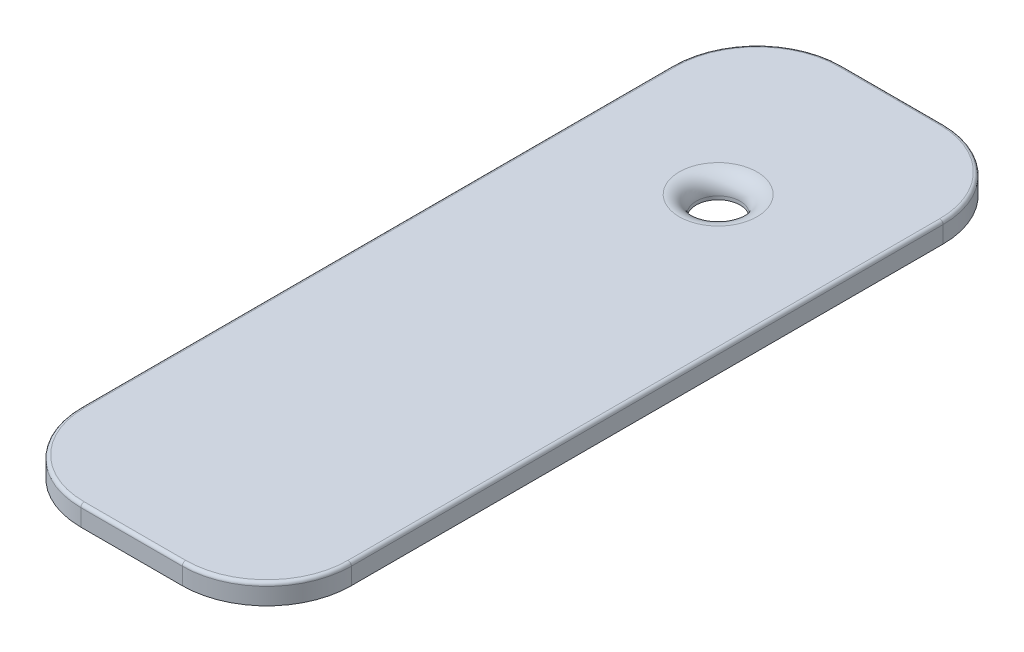
ISO-10303-21;
HEADER;
FILE_DESCRIPTION(('STEP AP214'),'2;1');
FILE_NAME('part.step','',(''),(''),'','','');
FILE_SCHEMA(('AUTOMOTIVE_DESIGN { 1 0 10303 214 1 1 1 1 }'));
ENDSEC;
DATA;
#1=APPLICATION_CONTEXT('core data for automotive mechanical design processes');
#2=APPLICATION_PROTOCOL_DEFINITION('international standard','automotive_design',2000,#1);
#3=PRODUCT_CONTEXT('',#1,'mechanical');
#4=PRODUCT('Part','Part','',(#3));
#5=PRODUCT_RELATED_PRODUCT_CATEGORY('part','',(#4));
#6=PRODUCT_DEFINITION_FORMATION('','',#4);
#7=PRODUCT_DEFINITION_CONTEXT('part definition',#1,'design');
#8=PRODUCT_DEFINITION('design','',#6,#7);
#9=PRODUCT_DEFINITION_SHAPE('','',#8);
#10=(LENGTH_UNIT() NAMED_UNIT(*) SI_UNIT(.MILLI.,.METRE.));
#11=(NAMED_UNIT(*) PLANE_ANGLE_UNIT() SI_UNIT($,.RADIAN.));
#12=(NAMED_UNIT(*) SI_UNIT($,.STERADIAN.) SOLID_ANGLE_UNIT());
#13=UNCERTAINTY_MEASURE_WITH_UNIT(LENGTH_MEASURE(1.E-05),#10,'distance_accuracy_value','');
#14=(GEOMETRIC_REPRESENTATION_CONTEXT(3) GLOBAL_UNCERTAINTY_ASSIGNED_CONTEXT((#13)) GLOBAL_UNIT_ASSIGNED_CONTEXT((#10,
#11,#12)) REPRESENTATION_CONTEXT('',''));
#15=CARTESIAN_POINT('',(0.,0.,0.));
#16=DIRECTION('',(0.,0.,1.));
#17=DIRECTION('',(1.,0.,0.));
#18=AXIS2_PLACEMENT_3D('',#15,#16,#17);
#19=CARTESIAN_POINT('',(18.5161231718812,6.,148.455918202134));
#20=DIRECTION('',(0.,-1.,0.));
#21=DIRECTION('',(0.,0.,-1.));
#22=AXIS2_PLACEMENT_3D('',#19,#20,#21);
#23=CYLINDRICAL_SURFACE('',#22,25.);
#24=DIRECTION('',(0.,-1.,0.));
#25=VECTOR('',#24,1.);
#26=CARTESIAN_POINT('',(43.5161231718812,6.,148.455918202134));
#27=LINE('',#26,#25);
#28=CARTESIAN_POINT('',(43.5161231718812,5.,148.455918202134));
#29=VERTEX_POINT('',#28);
#30=CARTESIAN_POINT('',(43.5161231718812,0.,148.455918202134));
#31=VERTEX_POINT('',#30);
#32=EDGE_CURVE('E126',#29,#31,#27,.T.);
#33=ORIENTED_EDGE('',*,*,#32,.F.);
#34=CARTESIAN_POINT('',(18.5161231718812,5.,148.455918202134));
#35=DIRECTION('',(0.,1.,0.));
#36=DIRECTION('',(0.,0.,1.));
#37=AXIS2_PLACEMENT_3D('',#34,#35,#36);
#38=CIRCLE('',#37,25.);
#39=CARTESIAN_POINT('',(18.516123171881,5.,173.455918202134));
#40=VERTEX_POINT('',#39);
#41=EDGE_CURVE('E204',#29,#40,#38,.F.);
#42=ORIENTED_EDGE('',*,*,#41,.T.);
#43=DIRECTION('',(0.,-1.,0.));
#44=VECTOR('',#43,1.);
#45=CARTESIAN_POINT('',(18.516123171881,6.,173.455918202134));
#46=LINE('',#45,#44);
#47=CARTESIAN_POINT('',(18.516123171881,0.,173.455918202134));
#48=VERTEX_POINT('',#47);
#49=EDGE_CURVE('E151',#40,#48,#46,.T.);
#50=ORIENTED_EDGE('',*,*,#49,.T.);
#51=CARTESIAN_POINT('',(18.5161231718812,0.,148.455918202134));
#52=DIRECTION('',(0.,1.,0.));
#53=DIRECTION('',(0.,0.,1.));
#54=AXIS2_PLACEMENT_3D('',#51,#52,#53);
#55=CIRCLE('',#54,25.);
#56=EDGE_CURVE('E145',#48,#31,#55,.T.);
#57=ORIENTED_EDGE('',*,*,#56,.T.);
#58=EDGE_LOOP('',(#33,#42,#50,#57));
#59=FACE_BOUND('',#58,.T.);
#60=ADVANCED_FACE('F36',(#59),#23,.T.);
#61=CARTESIAN_POINT('',(43.5161231718812,6.,-26.5440817978654));
#62=DIRECTION('',(-1.,0.,0.));
#63=DIRECTION('',(0.,0.,1.));
#64=AXIS2_PLACEMENT_3D('',#61,#62,#63);
#65=PLANE('',#64);
#66=DIRECTION('',(0.,-1.,0.));
#67=VECTOR('',#66,1.);
#68=CARTESIAN_POINT('',(43.5161231718812,6.,-26.5440817978654));
#69=LINE('',#68,#67);
#70=CARTESIAN_POINT('',(43.5161231718812,5.,-26.5440817978654));
#71=VERTEX_POINT('',#70);
#72=CARTESIAN_POINT('',(43.5161231718812,0.,-26.5440817978654));
#73=VERTEX_POINT('',#72);
#74=EDGE_CURVE('E139',#71,#73,#69,.T.);
#75=ORIENTED_EDGE('',*,*,#74,.F.);
#76=DIRECTION('',(0.,0.,-1.));
#77=VECTOR('',#76,1.);
#78=CARTESIAN_POINT('',(43.5161231718812,5.,148.455918202134));
#79=LINE('',#78,#77);
#80=EDGE_CURVE('E133',#71,#29,#79,.F.);
#81=ORIENTED_EDGE('',*,*,#80,.T.);
#82=ORIENTED_EDGE('',*,*,#32,.T.);
#83=DIRECTION('',(0.,0.,-1.));
#84=VECTOR('',#83,1.);
#85=CARTESIAN_POINT('',(43.5161231718812,0.,-26.5440817978654));
#86=LINE('',#85,#84);
#87=EDGE_CURVE('E130',#31,#73,#86,.T.);
#88=ORIENTED_EDGE('',*,*,#87,.T.);
#89=EDGE_LOOP('',(#75,#81,#82,#88));
#90=FACE_BOUND('',#89,.T.);
#91=ADVANCED_FACE('F129',(#90),#65,.F.);
#92=CARTESIAN_POINT('',(18.5161231718812,6.,-26.5440817978655));
#93=DIRECTION('',(0.,-1.,0.));
#94=DIRECTION('',(0.,0.,-1.));
#95=AXIS2_PLACEMENT_3D('',#92,#93,#94);
#96=CYLINDRICAL_SURFACE('',#95,25.);
#97=DIRECTION('',(0.,-1.,0.));
#98=VECTOR('',#97,1.);
#99=CARTESIAN_POINT('',(18.516123171881,6.,-51.5440817978655));
#100=LINE('',#99,#98);
#101=CARTESIAN_POINT('',(18.516123171881,5.,-51.5440817978655));
#102=VERTEX_POINT('',#101);
#103=CARTESIAN_POINT('',(18.516123171881,0.,-51.5440817978655));
#104=VERTEX_POINT('',#103);
#105=EDGE_CURVE('E185',#102,#104,#100,.T.);
#106=ORIENTED_EDGE('',*,*,#105,.F.);
#107=CARTESIAN_POINT('',(18.5161231718812,5.,-26.5440817978655));
#108=DIRECTION('',(0.,1.,0.));
#109=DIRECTION('',(0.,0.,1.));
#110=AXIS2_PLACEMENT_3D('',#107,#108,#109);
#111=CIRCLE('',#110,25.);
#112=EDGE_CURVE('E213',#102,#71,#111,.F.);
#113=ORIENTED_EDGE('',*,*,#112,.T.);
#114=ORIENTED_EDGE('',*,*,#74,.T.);
#115=CARTESIAN_POINT('',(18.5161231718812,0.,-26.5440817978655));
#116=DIRECTION('',(0.,1.,0.));
#117=DIRECTION('',(0.,0.,1.));
#118=AXIS2_PLACEMENT_3D('',#115,#116,#117);
#119=CIRCLE('',#118,25.);
#120=EDGE_CURVE('E148',#73,#104,#119,.T.);
#121=ORIENTED_EDGE('',*,*,#120,.T.);
#122=EDGE_LOOP('',(#106,#113,#114,#121));
#123=FACE_BOUND('',#122,.T.);
#124=ADVANCED_FACE('F253',(#123),#96,.T.);
#125=CARTESIAN_POINT('',(-11.4838768281187,6.,-51.5440817978655));
#126=DIRECTION('',(0.,0.,1.));
#127=DIRECTION('',(1.,0.,0.));
#128=AXIS2_PLACEMENT_3D('',#125,#126,#127);
#129=PLANE('',#128);
#130=DIRECTION('',(0.,-1.,0.));
#131=VECTOR('',#130,1.);
#132=CARTESIAN_POINT('',(-11.4838768281187,6.,-51.5440817978655));
#133=LINE('',#132,#131);
#134=CARTESIAN_POINT('',(-11.4838768281187,5.,-51.5440817978655));
#135=VERTEX_POINT('',#134);
#136=CARTESIAN_POINT('',(-11.4838768281187,0.,-51.5440817978655));
#137=VERTEX_POINT('',#136);
#138=EDGE_CURVE('E183',#135,#137,#133,.T.);
#139=ORIENTED_EDGE('',*,*,#138,.F.);
#140=DIRECTION('',(-1.,0.,0.));
#141=VECTOR('',#140,1.);
#142=CARTESIAN_POINT('',(18.516123171881,5.,-51.5440817978655));
#143=LINE('',#142,#141);
#144=EDGE_CURVE('E58',#135,#102,#143,.F.);
#145=ORIENTED_EDGE('',*,*,#144,.T.);
#146=ORIENTED_EDGE('',*,*,#105,.T.);
#147=DIRECTION('',(-1.,0.,0.));
#148=VECTOR('',#147,1.);
#149=CARTESIAN_POINT('',(-11.4838768281187,0.,-51.5440817978655));
#150=LINE('',#149,#148);
#151=EDGE_CURVE('E162',#104,#137,#150,.T.);
#152=ORIENTED_EDGE('',*,*,#151,.T.);
#153=EDGE_LOOP('',(#139,#145,#146,#152));
#154=FACE_BOUND('',#153,.T.);
#155=ADVANCED_FACE('F301',(#154),#129,.F.);
#156=CARTESIAN_POINT('',(-11.4838768281188,6.,-26.5440817978655));
#157=DIRECTION('',(0.,-1.,0.));
#158=DIRECTION('',(0.,0.,-1.));
#159=AXIS2_PLACEMENT_3D('',#156,#157,#158);
#160=CYLINDRICAL_SURFACE('',#159,25.);
#161=DIRECTION('',(0.,-1.,0.));
#162=VECTOR('',#161,1.);
#163=CARTESIAN_POINT('',(-36.4838768281189,6.,-26.5440817978654));
#164=LINE('',#163,#162);
#165=CARTESIAN_POINT('',(-36.4838768281189,5.,-26.5440817978654));
#166=VERTEX_POINT('',#165);
#167=CARTESIAN_POINT('',(-36.4838768281189,0.,-26.5440817978654));
#168=VERTEX_POINT('',#167);
#169=EDGE_CURVE('E181',#166,#168,#164,.T.);
#170=ORIENTED_EDGE('',*,*,#169,.F.);
#171=CARTESIAN_POINT('',(-11.4838768281188,5.,-26.5440817978655));
#172=DIRECTION('',(0.,1.,0.));
#173=DIRECTION('',(0.,0.,1.));
#174=AXIS2_PLACEMENT_3D('',#171,#172,#173);
#175=CIRCLE('',#174,25.);
#176=EDGE_CURVE('E51',#166,#135,#175,.F.);
#177=ORIENTED_EDGE('',*,*,#176,.T.);
#178=ORIENTED_EDGE('',*,*,#138,.T.);
#179=CARTESIAN_POINT('',(-11.4838768281188,0.,-26.5440817978655));
#180=DIRECTION('',(0.,1.,0.));
#181=DIRECTION('',(0.,0.,1.));
#182=AXIS2_PLACEMENT_3D('',#179,#180,#181);
#183=CIRCLE('',#182,25.);
#184=EDGE_CURVE('E165',#137,#168,#183,.T.);
#185=ORIENTED_EDGE('',*,*,#184,.T.);
#186=EDGE_LOOP('',(#170,#177,#178,#185));
#187=FACE_BOUND('',#186,.T.);
#188=ADVANCED_FACE('F305',(#187),#160,.T.);
#189=CARTESIAN_POINT('',(-36.4838768281189,6.,-26.5440817978654));
#190=DIRECTION('',(1.,0.,0.));
#191=DIRECTION('',(0.,0.,-1.));
#192=AXIS2_PLACEMENT_3D('',#189,#190,#191);
#193=PLANE('',#192);
#194=DIRECTION('',(0.,-1.,0.));
#195=VECTOR('',#194,1.);
#196=CARTESIAN_POINT('',(-36.4838768281189,6.,148.455918202134));
#197=LINE('',#196,#195);
#198=CARTESIAN_POINT('',(-36.4838768281189,5.,148.455918202134));
#199=VERTEX_POINT('',#198);
#200=CARTESIAN_POINT('',(-36.4838768281189,0.,148.455918202134));
#201=VERTEX_POINT('',#200);
#202=EDGE_CURVE('E179',#199,#201,#197,.T.);
#203=ORIENTED_EDGE('',*,*,#202,.F.);
#204=DIRECTION('',(0.,0.,1.));
#205=VECTOR('',#204,1.);
#206=CARTESIAN_POINT('',(-36.4838768281189,5.,-26.5440817978654));
#207=LINE('',#206,#205);
#208=EDGE_CURVE('E210',#199,#166,#207,.F.);
#209=ORIENTED_EDGE('',*,*,#208,.T.);
#210=ORIENTED_EDGE('',*,*,#169,.T.);
#211=DIRECTION('',(0.,0.,1.));
#212=VECTOR('',#211,1.);
#213=CARTESIAN_POINT('',(-36.4838768281189,0.,-26.5440817978654));
#214=LINE('',#213,#212);
#215=EDGE_CURVE('E168',#168,#201,#214,.T.);
#216=ORIENTED_EDGE('',*,*,#215,.T.);
#217=EDGE_LOOP('',(#203,#209,#210,#216));
#218=FACE_BOUND('',#217,.T.);
#219=ADVANCED_FACE('F308',(#218),#193,.F.);
#220=CARTESIAN_POINT('',(-11.4838768281188,6.,148.455918202134));
#221=DIRECTION('',(0.,-1.,0.));
#222=DIRECTION('',(0.,0.,-1.));
#223=AXIS2_PLACEMENT_3D('',#220,#221,#222);
#224=CYLINDRICAL_SURFACE('',#223,25.);
#225=DIRECTION('',(0.,-1.,0.));
#226=VECTOR('',#225,1.);
#227=CARTESIAN_POINT('',(-11.4838768281187,6.,173.455918202134));
#228=LINE('',#227,#226);
#229=CARTESIAN_POINT('',(-11.4838768281187,5.,173.455918202134));
#230=VERTEX_POINT('',#229);
#231=CARTESIAN_POINT('',(-11.4838768281187,0.,173.455918202134));
#232=VERTEX_POINT('',#231);
#233=EDGE_CURVE('E177',#230,#232,#228,.T.);
#234=ORIENTED_EDGE('',*,*,#233,.F.);
#235=CARTESIAN_POINT('',(-11.4838768281188,5.,148.455918202134));
#236=DIRECTION('',(0.,1.,0.));
#237=DIRECTION('',(0.,0.,1.));
#238=AXIS2_PLACEMENT_3D('',#235,#236,#237);
#239=CIRCLE('',#238,25.);
#240=EDGE_CURVE('E208',#230,#199,#239,.F.);
#241=ORIENTED_EDGE('',*,*,#240,.T.);
#242=ORIENTED_EDGE('',*,*,#202,.T.);
#243=CARTESIAN_POINT('',(-11.4838768281188,0.,148.455918202134));
#244=DIRECTION('',(0.,1.,0.));
#245=DIRECTION('',(0.,0.,-1.));
#246=AXIS2_PLACEMENT_3D('',#243,#244,#245);
#247=CIRCLE('',#246,25.);
#248=EDGE_CURVE('E171',#201,#232,#247,.T.);
#249=ORIENTED_EDGE('',*,*,#248,.T.);
#250=EDGE_LOOP('',(#234,#241,#242,#249));
#251=FACE_BOUND('',#250,.T.);
#252=ADVANCED_FACE('F326',(#251),#224,.T.);
#253=CARTESIAN_POINT('',(-11.4838768281187,6.,173.455918202134));
#254=DIRECTION('',(0.,0.,-1.));
#255=DIRECTION('',(-1.,0.,0.));
#256=AXIS2_PLACEMENT_3D('',#253,#254,#255);
#257=PLANE('',#256);
#258=ORIENTED_EDGE('',*,*,#49,.F.);
#259=DIRECTION('',(1.,0.,0.));
#260=VECTOR('',#259,1.);
#261=CARTESIAN_POINT('',(-11.4838768281187,5.,173.455918202134));
#262=LINE('',#261,#260);
#263=EDGE_CURVE('E206',#40,#230,#262,.F.);
#264=ORIENTED_EDGE('',*,*,#263,.T.);
#265=ORIENTED_EDGE('',*,*,#233,.T.);
#266=DIRECTION('',(1.,0.,0.));
#267=VECTOR('',#266,1.);
#268=CARTESIAN_POINT('',(-11.4838768281187,0.,173.455918202134));
#269=LINE('',#268,#267);
#270=EDGE_CURVE('E174',#232,#48,#269,.T.);
#271=ORIENTED_EDGE('',*,*,#270,.T.);
#272=EDGE_LOOP('',(#258,#264,#265,#271));
#273=FACE_BOUND('',#272,.T.);
#274=ADVANCED_FACE('F323',(#273),#257,.F.);
#275=CARTESIAN_POINT('',(18.5161231718812,6.,148.455918202134));
#276=DIRECTION('',(0.,1.,0.));
#277=DIRECTION('',(0.,0.,1.));
#278=AXIS2_PLACEMENT_3D('',#275,#276,#277);
#279=PLANE('',#278);
#280=CARTESIAN_POINT('',(3.51612317188115,6.,0.));
#281=DIRECTION('',(0.,1.,0.));
#282=DIRECTION('',(0.,0.,1.));
#283=AXIS2_PLACEMENT_3D('',#280,#281,#282);
#284=CIRCLE('',#283,11.5);
#285=CARTESIAN_POINT('',(3.51612317188115,6.,11.5));
#286=VERTEX_POINT('',#285);
#287=EDGE_CURVE('E11',#286,#286,#284,.F.);
#288=ORIENTED_EDGE('',*,*,#287,.T.);
#289=EDGE_LOOP('',(#288));
#290=FACE_BOUND('',#289,.T.);
#291=DIRECTION('',(1.,0.,0.));
#292=VECTOR('',#291,1.);
#293=CARTESIAN_POINT('',(18.516123171881,6.,172.455918202134));
#294=LINE('',#293,#292);
#295=CARTESIAN_POINT('',(-11.4838768281187,6.,172.455918202134));
#296=VERTEX_POINT('',#295);
#297=CARTESIAN_POINT('',(18.516123171881,6.,172.455918202134));
#298=VERTEX_POINT('',#297);
#299=EDGE_CURVE('E199',#296,#298,#294,.T.);
#300=ORIENTED_EDGE('',*,*,#299,.T.);
#301=CARTESIAN_POINT('',(18.5161231718812,6.,148.455918202134));
#302=DIRECTION('',(0.,1.,0.));
#303=DIRECTION('',(0.,0.,1.));
#304=AXIS2_PLACEMENT_3D('',#301,#302,#303);
#305=CIRCLE('',#304,24.);
#306=CARTESIAN_POINT('',(42.5161231718811,6.,148.455918202134));
#307=VERTEX_POINT('',#306);
#308=EDGE_CURVE('E201',#298,#307,#305,.T.);
#309=ORIENTED_EDGE('',*,*,#308,.T.);
#310=DIRECTION('',(0.,0.,-1.));
#311=VECTOR('',#310,1.);
#312=CARTESIAN_POINT('',(42.5161231718811,6.,-26.5440817978654));
#313=LINE('',#312,#311);
#314=CARTESIAN_POINT('',(42.5161231718811,6.,-26.5440817978654));
#315=VERTEX_POINT('',#314);
#316=EDGE_CURVE('E193',#307,#315,#313,.T.);
#317=ORIENTED_EDGE('',*,*,#316,.T.);
#318=CARTESIAN_POINT('',(18.5161231718812,6.,-26.5440817978655));
#319=DIRECTION('',(0.,1.,0.));
#320=DIRECTION('',(0.,0.,1.));
#321=AXIS2_PLACEMENT_3D('',#318,#319,#320);
#322=CIRCLE('',#321,24.);
#323=CARTESIAN_POINT('',(18.516123171881,6.,-50.5440817978655));
#324=VERTEX_POINT('',#323);
#325=EDGE_CURVE('E191',#315,#324,#322,.T.);
#326=ORIENTED_EDGE('',*,*,#325,.T.);
#327=DIRECTION('',(-1.,0.,0.));
#328=VECTOR('',#327,1.);
#329=CARTESIAN_POINT('',(-11.4838768281187,6.,-50.5440817978655));
#330=LINE('',#329,#328);
#331=CARTESIAN_POINT('',(-11.4838768281187,6.,-50.5440817978655));
#332=VERTEX_POINT('',#331);
#333=EDGE_CURVE('E138',#324,#332,#330,.T.);
#334=ORIENTED_EDGE('',*,*,#333,.T.);
#335=CARTESIAN_POINT('',(-11.4838768281188,6.,-26.5440817978655));
#336=DIRECTION('',(0.,1.,0.));
#337=DIRECTION('',(0.,0.,1.));
#338=AXIS2_PLACEMENT_3D('',#335,#336,#337);
#339=CIRCLE('',#338,24.);
#340=CARTESIAN_POINT('',(-35.4838768281189,6.,-26.5440817978654));
#341=VERTEX_POINT('',#340);
#342=EDGE_CURVE('E189',#332,#341,#339,.T.);
#343=ORIENTED_EDGE('',*,*,#342,.T.);
#344=DIRECTION('',(0.,0.,1.));
#345=VECTOR('',#344,1.);
#346=CARTESIAN_POINT('',(-35.4838768281189,6.,148.455918202134));
#347=LINE('',#346,#345);
#348=CARTESIAN_POINT('',(-35.4838768281189,6.,148.455918202134));
#349=VERTEX_POINT('',#348);
#350=EDGE_CURVE('E195',#341,#349,#347,.T.);
#351=ORIENTED_EDGE('',*,*,#350,.T.);
#352=CARTESIAN_POINT('',(-11.4838768281188,6.,148.455918202134));
#353=DIRECTION('',(0.,1.,0.));
#354=DIRECTION('',(0.,0.,1.));
#355=AXIS2_PLACEMENT_3D('',#352,#353,#354);
#356=CIRCLE('',#355,24.);
#357=EDGE_CURVE('E197',#349,#296,#356,.T.);
#358=ORIENTED_EDGE('',*,*,#357,.T.);
#359=EDGE_LOOP('',(#300,#309,#317,#326,#334,#343,#351,#358));
#360=FACE_BOUND('',#359,.T.);
#361=ADVANCED_FACE('F289',(#290,#360),#279,.T.);
#362=CARTESIAN_POINT('',(18.5161231718812,0.,148.455918202134));
#363=DIRECTION('',(0.,1.,0.));
#364=DIRECTION('',(0.,0.,1.));
#365=AXIS2_PLACEMENT_3D('',#362,#363,#364);
#366=PLANE('',#365);
#367=CARTESIAN_POINT('',(3.51612317188115,0.,0.));
#368=DIRECTION('',(0.,1.,0.));
#369=DIRECTION('',(0.,0.,1.));
#370=AXIS2_PLACEMENT_3D('',#367,#368,#369);
#371=CIRCLE('',#370,6.5);
#372=CARTESIAN_POINT('',(3.51612317188115,0.,6.5));
#373=VERTEX_POINT('',#372);
#374=EDGE_CURVE('E159',#373,#373,#371,.T.);
#375=ORIENTED_EDGE('',*,*,#374,.T.);
#376=EDGE_LOOP('',(#375));
#377=FACE_BOUND('',#376,.T.);
#378=ORIENTED_EDGE('',*,*,#56,.F.);
#379=ORIENTED_EDGE('',*,*,#270,.F.);
#380=ORIENTED_EDGE('',*,*,#248,.F.);
#381=ORIENTED_EDGE('',*,*,#215,.F.);
#382=ORIENTED_EDGE('',*,*,#184,.F.);
#383=ORIENTED_EDGE('',*,*,#151,.F.);
#384=ORIENTED_EDGE('',*,*,#120,.F.);
#385=ORIENTED_EDGE('',*,*,#87,.F.);
#386=EDGE_LOOP('',(#378,#379,#380,#381,#382,#383,#384,#385));
#387=FACE_BOUND('',#386,.T.);
#388=ADVANCED_FACE('F143',(#377,#387),#366,.F.);
#389=CARTESIAN_POINT('',(-11.4838768281188,5.,-26.5440817978655));
#390=DIRECTION('',(0.,1.,0.));
#391=DIRECTION('',(0.,0.,1.));
#392=AXIS2_PLACEMENT_3D('',#389,#390,#391);
#393=TOROIDAL_SURFACE('',#392,24.,1.);
#394=CARTESIAN_POINT('',(-11.4838768281187,5.,-50.5440817978655));
#395=DIRECTION('',(1.,0.,0.));
#396=DIRECTION('',(0.,0.,-1.));
#397=AXIS2_PLACEMENT_3D('',#394,#395,#396);
#398=CIRCLE('',#397,1.);
#399=EDGE_CURVE('E156',#135,#332,#398,.T.);
#400=ORIENTED_EDGE('',*,*,#399,.F.);
#401=ORIENTED_EDGE('',*,*,#176,.F.);
#402=CARTESIAN_POINT('',(-35.4838768281189,5.,-26.5440817978654));
#403=DIRECTION('',(0.,0.,1.));
#404=DIRECTION('',(1.,0.,0.));
#405=AXIS2_PLACEMENT_3D('',#402,#403,#404);
#406=CIRCLE('',#405,1.);
#407=EDGE_CURVE('E153',#341,#166,#406,.T.);
#408=ORIENTED_EDGE('',*,*,#407,.F.);
#409=ORIENTED_EDGE('',*,*,#342,.F.);
#410=EDGE_LOOP('',(#400,#401,#408,#409));
#411=FACE_BOUND('',#410,.T.);
#412=ADVANCED_FACE('F282',(#411),#393,.T.);
#413=CARTESIAN_POINT('',(-35.4838768281189,5.,148.455918202134));
#414=DIRECTION('',(0.,0.,-1.));
#415=DIRECTION('',(-1.,0.,0.));
#416=AXIS2_PLACEMENT_3D('',#413,#414,#415);
#417=CYLINDRICAL_SURFACE('',#416,1.);
#418=ORIENTED_EDGE('',*,*,#407,.T.);
#419=ORIENTED_EDGE('',*,*,#208,.F.);
#420=CARTESIAN_POINT('',(-35.4838768281189,5.,148.455918202134));
#421=DIRECTION('',(0.,0.,1.));
#422=DIRECTION('',(1.,0.,0.));
#423=AXIS2_PLACEMENT_3D('',#420,#421,#422);
#424=CIRCLE('',#423,1.);
#425=EDGE_CURVE('E230',#349,#199,#424,.T.);
#426=ORIENTED_EDGE('',*,*,#425,.F.);
#427=ORIENTED_EDGE('',*,*,#350,.F.);
#428=EDGE_LOOP('',(#418,#419,#426,#427));
#429=FACE_BOUND('',#428,.T.);
#430=ADVANCED_FACE('F279',(#429),#417,.T.);
#431=CARTESIAN_POINT('',(18.5161231718812,5.,-50.5440817978655));
#432=DIRECTION('',(1.,0.,0.));
#433=DIRECTION('',(0.,0.,-1.));
#434=AXIS2_PLACEMENT_3D('',#431,#432,#433);
#435=CYLINDRICAL_SURFACE('',#434,1.);
#436=ORIENTED_EDGE('',*,*,#399,.T.);
#437=ORIENTED_EDGE('',*,*,#333,.F.);
#438=CARTESIAN_POINT('',(18.516123171881,5.,-50.5440817978655));
#439=DIRECTION('',(1.,0.,0.));
#440=DIRECTION('',(0.,1.,0.));
#441=AXIS2_PLACEMENT_3D('',#438,#439,#440);
#442=CIRCLE('',#441,1.);
#443=EDGE_CURVE('E227',#102,#324,#442,.T.);
#444=ORIENTED_EDGE('',*,*,#443,.F.);
#445=ORIENTED_EDGE('',*,*,#144,.F.);
#446=EDGE_LOOP('',(#436,#437,#444,#445));
#447=FACE_BOUND('',#446,.T.);
#448=ADVANCED_FACE('F275',(#447),#435,.T.);
#449=CARTESIAN_POINT('',(-11.4838768281188,5.,148.455918202134));
#450=DIRECTION('',(0.,1.,0.));
#451=DIRECTION('',(0.,0.,1.));
#452=AXIS2_PLACEMENT_3D('',#449,#450,#451);
#453=TOROIDAL_SURFACE('',#452,24.,1.);
#454=ORIENTED_EDGE('',*,*,#425,.T.);
#455=ORIENTED_EDGE('',*,*,#240,.F.);
#456=CARTESIAN_POINT('',(-11.4838768281187,5.,172.455918202134));
#457=DIRECTION('',(1.,0.,0.));
#458=DIRECTION('',(0.,0.,-1.));
#459=AXIS2_PLACEMENT_3D('',#456,#457,#458);
#460=CIRCLE('',#459,1.);
#461=EDGE_CURVE('E224',#296,#230,#460,.T.);
#462=ORIENTED_EDGE('',*,*,#461,.F.);
#463=ORIENTED_EDGE('',*,*,#357,.F.);
#464=EDGE_LOOP('',(#454,#455,#462,#463));
#465=FACE_BOUND('',#464,.T.);
#466=ADVANCED_FACE('F271',(#465),#453,.T.);
#467=CARTESIAN_POINT('',(18.5161231718812,5.,-26.5440817978655));
#468=DIRECTION('',(0.,1.,0.));
#469=DIRECTION('',(0.,0.,1.));
#470=AXIS2_PLACEMENT_3D('',#467,#468,#469);
#471=TOROIDAL_SURFACE('',#470,24.,1.);
#472=ORIENTED_EDGE('',*,*,#443,.T.);
#473=ORIENTED_EDGE('',*,*,#325,.F.);
#474=CARTESIAN_POINT('',(42.5161231718811,5.,-26.5440817978654));
#475=DIRECTION('',(0.,0.,1.));
#476=DIRECTION('',(0.,-1.,0.));
#477=AXIS2_PLACEMENT_3D('',#474,#475,#476);
#478=CIRCLE('',#477,1.);
#479=EDGE_CURVE('E221',#71,#315,#478,.T.);
#480=ORIENTED_EDGE('',*,*,#479,.F.);
#481=ORIENTED_EDGE('',*,*,#112,.F.);
#482=EDGE_LOOP('',(#472,#473,#480,#481));
#483=FACE_BOUND('',#482,.T.);
#484=ADVANCED_FACE('F267',(#483),#471,.T.);
#485=CARTESIAN_POINT('',(18.5161231718812,5.,172.455918202134));
#486=DIRECTION('',(-1.,0.,0.));
#487=DIRECTION('',(0.,0.,1.));
#488=AXIS2_PLACEMENT_3D('',#485,#486,#487);
#489=CYLINDRICAL_SURFACE('',#488,1.);
#490=ORIENTED_EDGE('',*,*,#461,.T.);
#491=ORIENTED_EDGE('',*,*,#263,.F.);
#492=CARTESIAN_POINT('',(18.516123171881,5.,172.455918202134));
#493=DIRECTION('',(1.,0.,0.));
#494=DIRECTION('',(0.,0.,-1.));
#495=AXIS2_PLACEMENT_3D('',#492,#493,#494);
#496=CIRCLE('',#495,1.);
#497=EDGE_CURVE('E219',#298,#40,#496,.T.);
#498=ORIENTED_EDGE('',*,*,#497,.F.);
#499=ORIENTED_EDGE('',*,*,#299,.F.);
#500=EDGE_LOOP('',(#490,#491,#498,#499));
#501=FACE_BOUND('',#500,.T.);
#502=ADVANCED_FACE('F263',(#501),#489,.T.);
#503=CARTESIAN_POINT('',(42.5161231718811,5.,148.455918202134));
#504=DIRECTION('',(0.,0.,1.));
#505=DIRECTION('',(1.,0.,0.));
#506=AXIS2_PLACEMENT_3D('',#503,#504,#505);
#507=CYLINDRICAL_SURFACE('',#506,1.);
#508=ORIENTED_EDGE('',*,*,#479,.T.);
#509=ORIENTED_EDGE('',*,*,#316,.F.);
#510=CARTESIAN_POINT('',(42.5161231718811,5.,148.455918202134));
#511=DIRECTION('',(0.,0.,1.));
#512=DIRECTION('',(1.,0.,0.));
#513=AXIS2_PLACEMENT_3D('',#510,#511,#512);
#514=CIRCLE('',#513,1.);
#515=EDGE_CURVE('E217',#29,#307,#514,.T.);
#516=ORIENTED_EDGE('',*,*,#515,.F.);
#517=ORIENTED_EDGE('',*,*,#80,.F.);
#518=EDGE_LOOP('',(#508,#509,#516,#517));
#519=FACE_BOUND('',#518,.T.);
#520=ADVANCED_FACE('F259',(#519),#507,.T.);
#521=CARTESIAN_POINT('',(18.5161231718812,5.,148.455918202134));
#522=DIRECTION('',(0.,1.,0.));
#523=DIRECTION('',(0.,0.,1.));
#524=AXIS2_PLACEMENT_3D('',#521,#522,#523);
#525=TOROIDAL_SURFACE('',#524,24.,1.);
#526=ORIENTED_EDGE('',*,*,#497,.T.);
#527=ORIENTED_EDGE('',*,*,#41,.F.);
#528=ORIENTED_EDGE('',*,*,#515,.T.);
#529=ORIENTED_EDGE('',*,*,#308,.F.);
#530=EDGE_LOOP('',(#526,#527,#528,#529));
#531=FACE_BOUND('',#530,.T.);
#532=ADVANCED_FACE('F245',(#531),#525,.T.);
#533=CARTESIAN_POINT('',(3.51612317188115,0.,0.));
#534=DIRECTION('',(0.,1.,0.));
#535=DIRECTION('',(0.,0.,1.));
#536=AXIS2_PLACEMENT_3D('',#533,#534,#535);
#537=CYLINDRICAL_SURFACE('',#536,6.5);
#538=CARTESIAN_POINT('',(3.51612317188115,1.,0.));
#539=DIRECTION('',(0.,1.,0.));
#540=DIRECTION('',(0.,0.,1.));
#541=AXIS2_PLACEMENT_3D('',#538,#539,#540);
#542=CIRCLE('',#541,6.5);
#543=CARTESIAN_POINT('',(3.51612317188115,1.,6.5));
#544=VERTEX_POINT('',#543);
#545=EDGE_CURVE('E44',#544,#544,#542,.T.);
#546=ORIENTED_EDGE('',*,*,#545,.T.);
#547=EDGE_LOOP('',(#546));
#548=FACE_BOUND('',#547,.T.);
#549=ORIENTED_EDGE('',*,*,#374,.F.);
#550=EDGE_LOOP('',(#549));
#551=FACE_BOUND('',#550,.T.);
#552=ADVANCED_FACE('F237',(#548,#551),#537,.F.);
#553=CARTESIAN_POINT('',(3.51612317188115,1.,0.));
#554=DIRECTION('',(0.,1.,0.));
#555=DIRECTION('',(0.,0.,1.));
#556=AXIS2_PLACEMENT_3D('',#553,#554,#555);
#557=TOROIDAL_SURFACE('',#556,11.5,5.);
#558=ORIENTED_EDGE('',*,*,#287,.F.);
#559=EDGE_LOOP('',(#558));
#560=FACE_BOUND('',#559,.T.);
#561=ORIENTED_EDGE('',*,*,#545,.F.);
#562=EDGE_LOOP('',(#561));
#563=FACE_BOUND('',#562,.T.);
#564=ADVANCED_FACE('F38',(#560,#563),#557,.T.);
#565=CLOSED_SHELL('',(#60,#91,#124,#155,#188,#219,#252,#274,#361,#388,#412,#430,#448,#466,#484,
#502,#520,#532,#552,#564));
#566=MANIFOLD_SOLID_BREP('B2',#565);
#567=ADVANCED_BREP_SHAPE_REPRESENTATION('',(#18,#566),#14);
#568=SHAPE_DEFINITION_REPRESENTATION(#9,#567);
ENDSEC;
END-ISO-10303-21;
